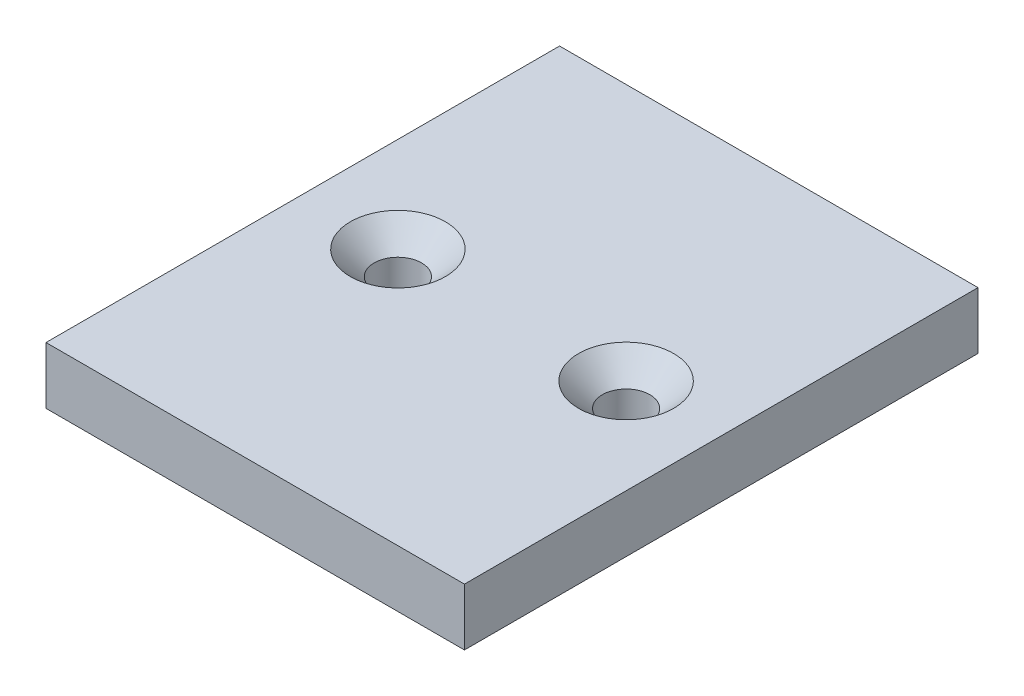
ISO-10303-21;
HEADER;
FILE_DESCRIPTION(('STEP AP214'),'2;1');
FILE_NAME('part.step','',(''),(''),'','','');
FILE_SCHEMA(('AUTOMOTIVE_DESIGN { 1 0 10303 214 1 1 1 1 }'));
ENDSEC;
DATA;
#1=APPLICATION_CONTEXT('core data for automotive mechanical design processes');
#2=APPLICATION_PROTOCOL_DEFINITION('international standard','automotive_design',2000,#1);
#3=PRODUCT_CONTEXT('',#1,'mechanical');
#4=PRODUCT('Part','Part','',(#3));
#5=PRODUCT_RELATED_PRODUCT_CATEGORY('part','',(#4));
#6=PRODUCT_DEFINITION_FORMATION('','',#4);
#7=PRODUCT_DEFINITION_CONTEXT('part definition',#1,'design');
#8=PRODUCT_DEFINITION('design','',#6,#7);
#9=PRODUCT_DEFINITION_SHAPE('','',#8);
#10=(LENGTH_UNIT() NAMED_UNIT(*) SI_UNIT(.MILLI.,.METRE.));
#11=(NAMED_UNIT(*) PLANE_ANGLE_UNIT() SI_UNIT($,.RADIAN.));
#12=(NAMED_UNIT(*) SI_UNIT($,.STERADIAN.) SOLID_ANGLE_UNIT());
#13=UNCERTAINTY_MEASURE_WITH_UNIT(LENGTH_MEASURE(1.E-05),#10,'distance_accuracy_value','');
#14=(GEOMETRIC_REPRESENTATION_CONTEXT(3) GLOBAL_UNCERTAINTY_ASSIGNED_CONTEXT((#13)) GLOBAL_UNIT_ASSIGNED_CONTEXT((#10,
#11,#12)) REPRESENTATION_CONTEXT('',''));
#15=CARTESIAN_POINT('',(0.,0.,0.));
#16=DIRECTION('',(0.,0.,1.));
#17=DIRECTION('',(1.,0.,0.));
#18=AXIS2_PLACEMENT_3D('',#15,#16,#17);
#19=CARTESIAN_POINT('',(0.,0.,27.));
#20=DIRECTION('',(1.,0.,0.));
#21=DIRECTION('',(0.,0.,-1.));
#22=AXIS2_PLACEMENT_3D('',#19,#20,#21);
#23=PLANE('',#22);
#24=DIRECTION('',(0.,-1.,0.));
#25=VECTOR('',#24,1.);
#26=CARTESIAN_POINT('',(0.,0.,-27.));
#27=LINE('',#26,#25);
#28=CARTESIAN_POINT('',(0.,6.,-27.));
#29=VERTEX_POINT('',#28);
#30=CARTESIAN_POINT('',(0.,0.,-27.));
#31=VERTEX_POINT('',#30);
#32=EDGE_CURVE('E94',#29,#31,#27,.T.);
#33=ORIENTED_EDGE('',*,*,#32,.T.);
#34=DIRECTION('',(0.,0.,-1.));
#35=VECTOR('',#34,1.);
#36=CARTESIAN_POINT('',(0.,0.,27.));
#37=LINE('',#36,#35);
#38=CARTESIAN_POINT('',(0.,0.,27.));
#39=VERTEX_POINT('',#38);
#40=EDGE_CURVE('E11',#39,#31,#37,.T.);
#41=ORIENTED_EDGE('',*,*,#40,.F.);
#42=DIRECTION('',(0.,-1.,0.));
#43=VECTOR('',#42,1.);
#44=CARTESIAN_POINT('',(0.,0.,27.));
#45=LINE('',#44,#43);
#46=CARTESIAN_POINT('',(0.,6.,27.));
#47=VERTEX_POINT('',#46);
#48=EDGE_CURVE('E82',#47,#39,#45,.T.);
#49=ORIENTED_EDGE('',*,*,#48,.F.);
#50=DIRECTION('',(0.,0.,-1.));
#51=VECTOR('',#50,1.);
#52=CARTESIAN_POINT('',(0.,6.,27.));
#53=LINE('',#52,#51);
#54=EDGE_CURVE('E90',#47,#29,#53,.T.);
#55=ORIENTED_EDGE('',*,*,#54,.T.);
#56=EDGE_LOOP('',(#33,#41,#49,#55));
#57=FACE_BOUND('',#56,.T.);
#58=ADVANCED_FACE('F31',(#57),#23,.F.);
#59=CARTESIAN_POINT('',(0.,0.,27.));
#60=DIRECTION('',(0.,1.,0.));
#61=DIRECTION('',(0.,0.,1.));
#62=AXIS2_PLACEMENT_3D('',#59,#60,#61);
#63=PLANE('',#62);
#64=CARTESIAN_POINT('',(10.,0.,0.));
#65=DIRECTION('',(0.,1.,0.));
#66=DIRECTION('',(0.,0.,1.));
#67=AXIS2_PLACEMENT_3D('',#64,#65,#66);
#68=CIRCLE('',#67,2.5);
#69=CARTESIAN_POINT('',(10.,0.,2.5));
#70=VERTEX_POINT('',#69);
#71=EDGE_CURVE('E116',#70,#70,#68,.T.);
#72=ORIENTED_EDGE('',*,*,#71,.T.);
#73=EDGE_LOOP('',(#72));
#74=FACE_BOUND('',#73,.T.);
#75=CARTESIAN_POINT('',(34.,0.,0.));
#76=DIRECTION('',(0.,1.,0.));
#77=DIRECTION('',(0.,0.,1.));
#78=AXIS2_PLACEMENT_3D('',#75,#76,#77);
#79=CIRCLE('',#78,2.5);
#80=CARTESIAN_POINT('',(34.,0.,2.5));
#81=VERTEX_POINT('',#80);
#82=EDGE_CURVE('E97',#81,#81,#79,.T.);
#83=ORIENTED_EDGE('',*,*,#82,.T.);
#84=EDGE_LOOP('',(#83));
#85=FACE_BOUND('',#84,.T.);
#86=DIRECTION('',(1.,0.,0.));
#87=VECTOR('',#86,1.);
#88=CARTESIAN_POINT('',(0.,0.,-27.));
#89=LINE('',#88,#87);
#90=CARTESIAN_POINT('',(44.,0.,-27.));
#91=VERTEX_POINT('',#90);
#92=EDGE_CURVE('E86',#31,#91,#89,.T.);
#93=ORIENTED_EDGE('',*,*,#92,.T.);
#94=DIRECTION('',(0.,0.,-1.));
#95=VECTOR('',#94,1.);
#96=CARTESIAN_POINT('',(44.,0.,27.));
#97=LINE('',#96,#95);
#98=CARTESIAN_POINT('',(44.,0.,27.));
#99=VERTEX_POINT('',#98);
#100=EDGE_CURVE('E39',#99,#91,#97,.T.);
#101=ORIENTED_EDGE('',*,*,#100,.F.);
#102=DIRECTION('',(1.,0.,0.));
#103=VECTOR('',#102,1.);
#104=CARTESIAN_POINT('',(0.,0.,27.));
#105=LINE('',#104,#103);
#106=EDGE_CURVE('E77',#39,#99,#105,.T.);
#107=ORIENTED_EDGE('',*,*,#106,.F.);
#108=ORIENTED_EDGE('',*,*,#40,.T.);
#109=EDGE_LOOP('',(#93,#101,#107,#108));
#110=FACE_BOUND('',#109,.T.);
#111=ADVANCED_FACE('F85',(#74,#85,#110),#63,.F.);
#112=CARTESIAN_POINT('',(44.,0.,27.));
#113=DIRECTION('',(-1.,0.,0.));
#114=DIRECTION('',(0.,0.,1.));
#115=AXIS2_PLACEMENT_3D('',#112,#113,#114);
#116=PLANE('',#115);
#117=DIRECTION('',(0.,1.,0.));
#118=VECTOR('',#117,1.);
#119=CARTESIAN_POINT('',(44.,0.,-27.));
#120=LINE('',#119,#118);
#121=CARTESIAN_POINT('',(44.,6.,-27.));
#122=VERTEX_POINT('',#121);
#123=EDGE_CURVE('E64',#91,#122,#120,.T.);
#124=ORIENTED_EDGE('',*,*,#123,.T.);
#125=DIRECTION('',(0.,0.,-1.));
#126=VECTOR('',#125,1.);
#127=CARTESIAN_POINT('',(44.,6.,27.));
#128=LINE('',#127,#126);
#129=CARTESIAN_POINT('',(44.,6.,27.));
#130=VERTEX_POINT('',#129);
#131=EDGE_CURVE('E87',#130,#122,#128,.T.);
#132=ORIENTED_EDGE('',*,*,#131,.F.);
#133=DIRECTION('',(0.,1.,0.));
#134=VECTOR('',#133,1.);
#135=CARTESIAN_POINT('',(44.,0.,27.));
#136=LINE('',#135,#134);
#137=EDGE_CURVE('E80',#99,#130,#136,.T.);
#138=ORIENTED_EDGE('',*,*,#137,.F.);
#139=ORIENTED_EDGE('',*,*,#100,.T.);
#140=EDGE_LOOP('',(#124,#132,#138,#139));
#141=FACE_BOUND('',#140,.T.);
#142=ADVANCED_FACE('F88',(#141),#116,.F.);
#143=CARTESIAN_POINT('',(0.,6.,27.));
#144=DIRECTION('',(0.,-1.,0.));
#145=DIRECTION('',(0.,0.,-1.));
#146=AXIS2_PLACEMENT_3D('',#143,#144,#145);
#147=PLANE('',#146);
#148=CARTESIAN_POINT('',(10.,6.,0.));
#149=DIRECTION('',(0.,1.,0.));
#150=DIRECTION('',(0.,0.,1.));
#151=AXIS2_PLACEMENT_3D('',#148,#149,#150);
#152=CIRCLE('',#151,5.);
#153=CARTESIAN_POINT('',(10.,6.,5.));
#154=VERTEX_POINT('',#153);
#155=EDGE_CURVE('E122',#154,#154,#152,.T.);
#156=ORIENTED_EDGE('',*,*,#155,.F.);
#157=EDGE_LOOP('',(#156));
#158=FACE_BOUND('',#157,.T.);
#159=CARTESIAN_POINT('',(34.,6.,0.));
#160=DIRECTION('',(0.,1.,0.));
#161=DIRECTION('',(0.,0.,1.));
#162=AXIS2_PLACEMENT_3D('',#159,#160,#161);
#163=CIRCLE('',#162,5.);
#164=CARTESIAN_POINT('',(34.,6.,5.));
#165=VERTEX_POINT('',#164);
#166=EDGE_CURVE('E113',#165,#165,#163,.T.);
#167=ORIENTED_EDGE('',*,*,#166,.F.);
#168=EDGE_LOOP('',(#167));
#169=FACE_BOUND('',#168,.T.);
#170=DIRECTION('',(-1.,0.,0.));
#171=VECTOR('',#170,1.);
#172=CARTESIAN_POINT('',(0.,6.,-27.));
#173=LINE('',#172,#171);
#174=EDGE_CURVE('E70',#122,#29,#173,.T.);
#175=ORIENTED_EDGE('',*,*,#174,.T.);
#176=ORIENTED_EDGE('',*,*,#54,.F.);
#177=DIRECTION('',(-1.,0.,0.));
#178=VECTOR('',#177,1.);
#179=CARTESIAN_POINT('',(0.,6.,27.));
#180=LINE('',#179,#178);
#181=EDGE_CURVE('E47',#130,#47,#180,.T.);
#182=ORIENTED_EDGE('',*,*,#181,.F.);
#183=ORIENTED_EDGE('',*,*,#131,.T.);
#184=EDGE_LOOP('',(#175,#176,#182,#183));
#185=FACE_BOUND('',#184,.T.);
#186=ADVANCED_FACE('F102',(#158,#169,#185),#147,.F.);
#187=CARTESIAN_POINT('',(0.,6.,27.));
#188=DIRECTION('',(0.,0.,-1.));
#189=DIRECTION('',(-1.,0.,0.));
#190=AXIS2_PLACEMENT_3D('',#187,#188,#189);
#191=PLANE('',#190);
#192=ORIENTED_EDGE('',*,*,#48,.T.);
#193=ORIENTED_EDGE('',*,*,#106,.T.);
#194=ORIENTED_EDGE('',*,*,#137,.T.);
#195=ORIENTED_EDGE('',*,*,#181,.T.);
#196=EDGE_LOOP('',(#192,#193,#194,#195));
#197=FACE_BOUND('',#196,.T.);
#198=ADVANCED_FACE('F78',(#197),#191,.F.);
#199=CARTESIAN_POINT('',(0.,6.,-27.));
#200=DIRECTION('',(0.,0.,-1.));
#201=DIRECTION('',(-1.,0.,0.));
#202=AXIS2_PLACEMENT_3D('',#199,#200,#201);
#203=PLANE('',#202);
#204=ORIENTED_EDGE('',*,*,#32,.F.);
#205=ORIENTED_EDGE('',*,*,#174,.F.);
#206=ORIENTED_EDGE('',*,*,#123,.F.);
#207=ORIENTED_EDGE('',*,*,#92,.F.);
#208=EDGE_LOOP('',(#204,#205,#206,#207));
#209=FACE_BOUND('',#208,.T.);
#210=ADVANCED_FACE('F105',(#209),#203,.T.);
#211=CARTESIAN_POINT('',(34.,6.,0.));
#212=DIRECTION('',(0.,1.,0.));
#213=DIRECTION('',(0.,0.,1.));
#214=AXIS2_PLACEMENT_3D('',#211,#212,#213);
#215=CYLINDRICAL_SURFACE('',#214,2.5);
#216=ORIENTED_EDGE('',*,*,#82,.F.);
#217=EDGE_LOOP('',(#216));
#218=FACE_BOUND('',#217,.T.);
#219=CARTESIAN_POINT('',(34.,3.5,0.));
#220=DIRECTION('',(0.,1.,0.));
#221=DIRECTION('',(0.,0.,1.));
#222=AXIS2_PLACEMENT_3D('',#219,#220,#221);
#223=CIRCLE('',#222,2.5);
#224=CARTESIAN_POINT('',(34.,3.5,2.5));
#225=VERTEX_POINT('',#224);
#226=EDGE_CURVE('E110',#225,#225,#223,.T.);
#227=ORIENTED_EDGE('',*,*,#226,.T.);
#228=EDGE_LOOP('',(#227));
#229=FACE_BOUND('',#228,.T.);
#230=ADVANCED_FACE('F136',(#218,#229),#215,.F.);
#231=CARTESIAN_POINT('',(34.,6.,0.));
#232=DIRECTION('',(0.,1.,0.));
#233=DIRECTION('',(0.,0.,1.));
#234=AXIS2_PLACEMENT_3D('',#231,#232,#233);
#235=CONICAL_SURFACE('',#234,5.,0.785398163397447);
#236=ORIENTED_EDGE('',*,*,#226,.F.);
#237=EDGE_LOOP('',(#236));
#238=FACE_BOUND('',#237,.T.);
#239=ORIENTED_EDGE('',*,*,#166,.T.);
#240=EDGE_LOOP('',(#239));
#241=FACE_BOUND('',#240,.T.);
#242=ADVANCED_FACE('F133',(#238,#241),#235,.F.);
#243=CARTESIAN_POINT('',(10.,6.,0.));
#244=DIRECTION('',(0.,1.,0.));
#245=DIRECTION('',(0.,0.,1.));
#246=AXIS2_PLACEMENT_3D('',#243,#244,#245);
#247=CYLINDRICAL_SURFACE('',#246,2.5);
#248=ORIENTED_EDGE('',*,*,#71,.F.);
#249=EDGE_LOOP('',(#248));
#250=FACE_BOUND('',#249,.T.);
#251=CARTESIAN_POINT('',(10.,3.5,0.));
#252=DIRECTION('',(0.,1.,0.));
#253=DIRECTION('',(0.,0.,1.));
#254=AXIS2_PLACEMENT_3D('',#251,#252,#253);
#255=CIRCLE('',#254,2.5);
#256=CARTESIAN_POINT('',(10.,3.5,2.5));
#257=VERTEX_POINT('',#256);
#258=EDGE_CURVE('E119',#257,#257,#255,.T.);
#259=ORIENTED_EDGE('',*,*,#258,.T.);
#260=EDGE_LOOP('',(#259));
#261=FACE_BOUND('',#260,.T.);
#262=ADVANCED_FACE('F135',(#250,#261),#247,.F.);
#263=CARTESIAN_POINT('',(10.,6.,0.));
#264=DIRECTION('',(0.,1.,0.));
#265=DIRECTION('',(0.,0.,1.));
#266=AXIS2_PLACEMENT_3D('',#263,#264,#265);
#267=CONICAL_SURFACE('',#266,5.,0.785398163397448);
#268=ORIENTED_EDGE('',*,*,#258,.F.);
#269=EDGE_LOOP('',(#268));
#270=FACE_BOUND('',#269,.T.);
#271=ORIENTED_EDGE('',*,*,#155,.T.);
#272=EDGE_LOOP('',(#271));
#273=FACE_BOUND('',#272,.T.);
#274=ADVANCED_FACE('F126',(#270,#273),#267,.F.);
#275=CLOSED_SHELL('',(#58,#111,#142,#186,#198,#210,#230,#242,#262,#274));
#276=MANIFOLD_SOLID_BREP('B2',#275);
#277=ADVANCED_BREP_SHAPE_REPRESENTATION('',(#18,#276),#14);
#278=SHAPE_DEFINITION_REPRESENTATION(#9,#277);
ENDSEC;
END-ISO-10303-21;
